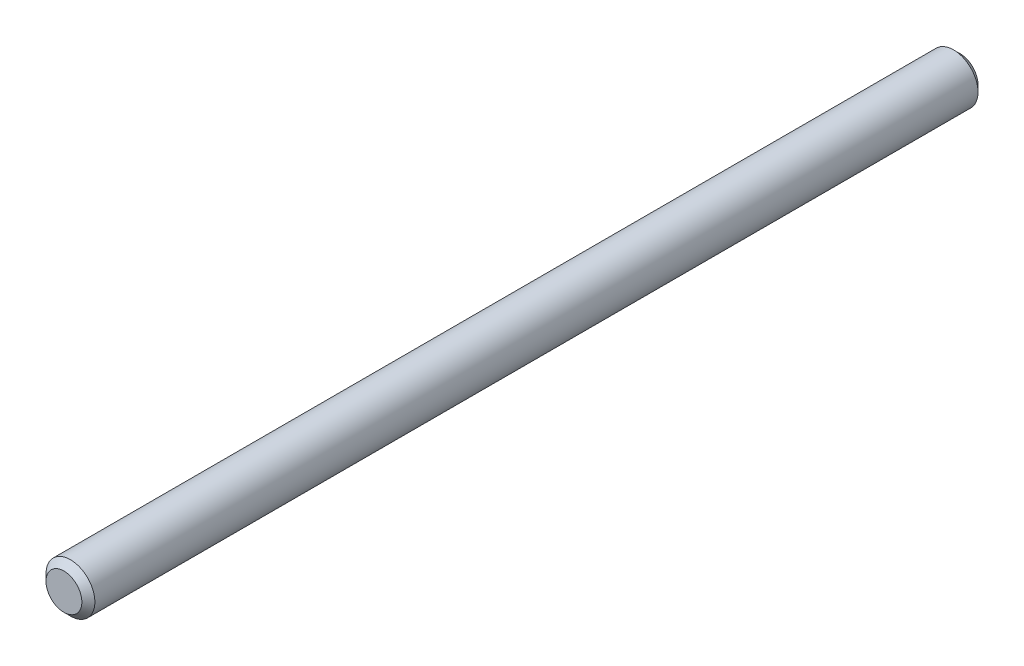
ISO-10303-21;
HEADER;
FILE_DESCRIPTION(('STEP AP214'),'2;1');
FILE_NAME('part.step','',(''),(''),'','','');
FILE_SCHEMA(('AUTOMOTIVE_DESIGN { 1 0 10303 214 1 1 1 1 }'));
ENDSEC;
DATA;
#1=APPLICATION_CONTEXT('core data for automotive mechanical design processes');
#2=APPLICATION_PROTOCOL_DEFINITION('international standard','automotive_design',2000,#1);
#3=PRODUCT_CONTEXT('',#1,'mechanical');
#4=PRODUCT('Part','Part','',(#3));
#5=PRODUCT_RELATED_PRODUCT_CATEGORY('part','',(#4));
#6=PRODUCT_DEFINITION_FORMATION('','',#4);
#7=PRODUCT_DEFINITION_CONTEXT('part definition',#1,'design');
#8=PRODUCT_DEFINITION('design','',#6,#7);
#9=PRODUCT_DEFINITION_SHAPE('','',#8);
#10=(LENGTH_UNIT() NAMED_UNIT(*) SI_UNIT(.MILLI.,.METRE.));
#11=(NAMED_UNIT(*) PLANE_ANGLE_UNIT() SI_UNIT($,.RADIAN.));
#12=(NAMED_UNIT(*) SI_UNIT($,.STERADIAN.) SOLID_ANGLE_UNIT());
#13=UNCERTAINTY_MEASURE_WITH_UNIT(LENGTH_MEASURE(1.E-05),#10,'distance_accuracy_value','');
#14=(GEOMETRIC_REPRESENTATION_CONTEXT(3) GLOBAL_UNCERTAINTY_ASSIGNED_CONTEXT((#13)) GLOBAL_UNIT_ASSIGNED_CONTEXT((#10,
#11,#12)) REPRESENTATION_CONTEXT('',''));
#15=CARTESIAN_POINT('',(0.,0.,0.));
#16=DIRECTION('',(0.,0.,1.));
#17=DIRECTION('',(1.,0.,0.));
#18=AXIS2_PLACEMENT_3D('',#15,#16,#17);
#19=CARTESIAN_POINT('',(0.,0.,137.5));
#20=DIRECTION('',(0.,0.,-1.));
#21=DIRECTION('',(-1.,0.,0.));
#22=AXIS2_PLACEMENT_3D('',#19,#20,#21);
#23=CYLINDRICAL_SURFACE('',#22,7.5);
#24=CARTESIAN_POINT('',(0.,0.,-135.5));
#25=DIRECTION('',(0.,0.,1.));
#26=DIRECTION('',(1.,0.,0.));
#27=AXIS2_PLACEMENT_3D('',#24,#25,#26);
#28=CIRCLE('',#27,7.5);
#29=CARTESIAN_POINT('',(7.5,0.,-135.5));
#30=VERTEX_POINT('',#29);
#31=EDGE_CURVE('E47',#30,#30,#28,.T.);
#32=ORIENTED_EDGE('',*,*,#31,.T.);
#33=EDGE_LOOP('',(#32));
#34=FACE_BOUND('',#33,.T.);
#35=CARTESIAN_POINT('',(0.,0.,135.5));
#36=DIRECTION('',(0.,0.,1.));
#37=DIRECTION('',(1.,0.,0.));
#38=AXIS2_PLACEMENT_3D('',#35,#36,#37);
#39=CIRCLE('',#38,7.5);
#40=CARTESIAN_POINT('',(7.5,0.,135.5));
#41=VERTEX_POINT('',#40);
#42=EDGE_CURVE('E51',#41,#41,#39,.F.);
#43=ORIENTED_EDGE('',*,*,#42,.T.);
#44=EDGE_LOOP('',(#43));
#45=FACE_BOUND('',#44,.T.);
#46=ADVANCED_FACE('F35',(#34,#45),#23,.T.);
#47=CARTESIAN_POINT('',(0.,0.,137.5));
#48=DIRECTION('',(0.,0.,1.));
#49=DIRECTION('',(1.,0.,0.));
#50=AXIS2_PLACEMENT_3D('',#47,#48,#49);
#51=PLANE('',#50);
#52=CARTESIAN_POINT('',(0.,0.,137.5));
#53=DIRECTION('',(0.,0.,1.));
#54=DIRECTION('',(1.,0.,0.));
#55=AXIS2_PLACEMENT_3D('',#52,#53,#54);
#56=CIRCLE('',#55,5.50000000000006);
#57=CARTESIAN_POINT('',(5.50000000000006,0.,137.5));
#58=VERTEX_POINT('',#57);
#59=EDGE_CURVE('E10',#58,#58,#56,.T.);
#60=ORIENTED_EDGE('',*,*,#59,.T.);
#61=EDGE_LOOP('',(#60));
#62=FACE_BOUND('',#61,.T.);
#63=ADVANCED_FACE('F67',(#62),#51,.T.);
#64=CARTESIAN_POINT('',(0.,0.,-137.5));
#65=DIRECTION('',(0.,0.,1.));
#66=DIRECTION('',(1.,0.,0.));
#67=AXIS2_PLACEMENT_3D('',#64,#65,#66);
#68=PLANE('',#67);
#69=CARTESIAN_POINT('',(0.,0.,-137.5));
#70=DIRECTION('',(0.,0.,1.));
#71=DIRECTION('',(1.,0.,0.));
#72=AXIS2_PLACEMENT_3D('',#69,#70,#71);
#73=CIRCLE('',#72,5.5);
#74=CARTESIAN_POINT('',(5.5,0.,-137.5));
#75=VERTEX_POINT('',#74);
#76=EDGE_CURVE('E43',#75,#75,#73,.F.);
#77=ORIENTED_EDGE('',*,*,#76,.T.);
#78=EDGE_LOOP('',(#77));
#79=FACE_BOUND('',#78,.T.);
#80=ADVANCED_FACE('F64',(#79),#68,.F.);
#81=CARTESIAN_POINT('',(0.,0.,-135.5));
#82=DIRECTION('',(0.,0.,1.));
#83=DIRECTION('',(1.,0.,0.));
#84=AXIS2_PLACEMENT_3D('',#81,#82,#83);
#85=CONICAL_SURFACE('',#84,7.5,0.785398163397447);
#86=ORIENTED_EDGE('',*,*,#76,.F.);
#87=EDGE_LOOP('',(#86));
#88=FACE_BOUND('',#87,.T.);
#89=ORIENTED_EDGE('',*,*,#31,.F.);
#90=EDGE_LOOP('',(#89));
#91=FACE_BOUND('',#90,.T.);
#92=ADVANCED_FACE('F60',(#88,#91),#85,.T.);
#93=CARTESIAN_POINT('',(0.,0.,137.5));
#94=DIRECTION('',(0.,0.,-1.));
#95=DIRECTION('',(-1.,0.,0.));
#96=AXIS2_PLACEMENT_3D('',#93,#94,#95);
#97=CONICAL_SURFACE('',#96,5.50000000000006,0.785398163397447);
#98=ORIENTED_EDGE('',*,*,#42,.F.);
#99=EDGE_LOOP('',(#98));
#100=FACE_BOUND('',#99,.T.);
#101=ORIENTED_EDGE('',*,*,#59,.F.);
#102=EDGE_LOOP('',(#101));
#103=FACE_BOUND('',#102,.T.);
#104=ADVANCED_FACE('F38',(#100,#103),#97,.T.);
#105=CLOSED_SHELL('',(#46,#63,#80,#92,#104));
#106=MANIFOLD_SOLID_BREP('B2',#105);
#107=ADVANCED_BREP_SHAPE_REPRESENTATION('',(#18,#106),#14);
#108=SHAPE_DEFINITION_REPRESENTATION(#9,#107);
ENDSEC;
END-ISO-10303-21;
